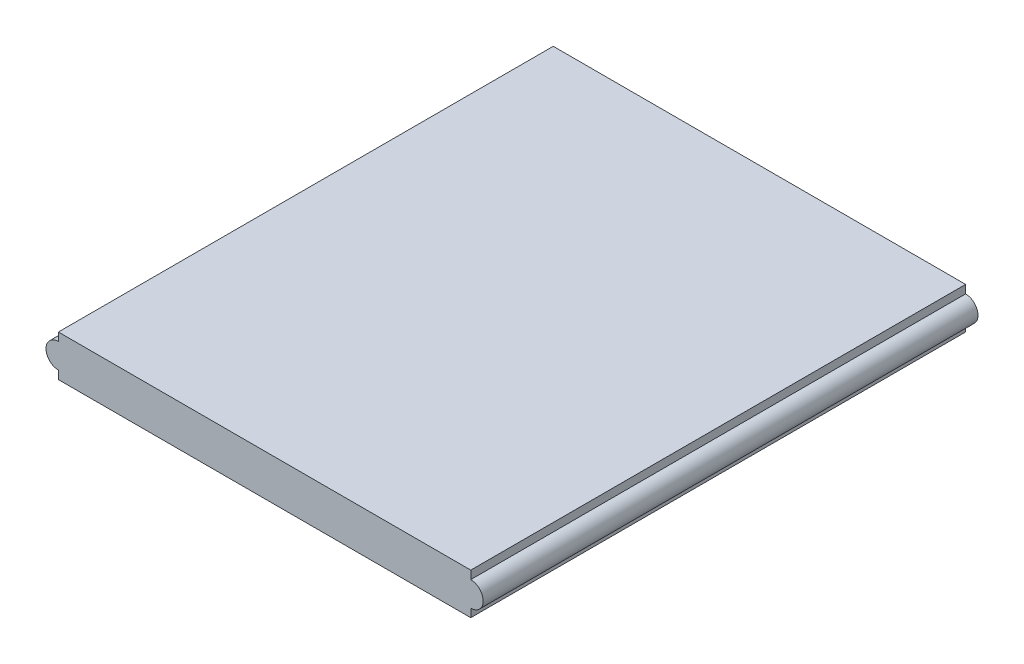
ISO-10303-21;
HEADER;
FILE_DESCRIPTION(('STEP AP214'),'2;1');
FILE_NAME('part.step','',(''),(''),'','','');
FILE_SCHEMA(('AUTOMOTIVE_DESIGN { 1 0 10303 214 1 1 1 1 }'));
ENDSEC;
DATA;
#1=APPLICATION_CONTEXT('core data for automotive mechanical design processes');
#2=APPLICATION_PROTOCOL_DEFINITION('international standard','automotive_design',2000,#1);
#3=PRODUCT_CONTEXT('',#1,'mechanical');
#4=PRODUCT('Part','Part','',(#3));
#5=PRODUCT_RELATED_PRODUCT_CATEGORY('part','',(#4));
#6=PRODUCT_DEFINITION_FORMATION('','',#4);
#7=PRODUCT_DEFINITION_CONTEXT('part definition',#1,'design');
#8=PRODUCT_DEFINITION('design','',#6,#7);
#9=PRODUCT_DEFINITION_SHAPE('','',#8);
#10=(LENGTH_UNIT() NAMED_UNIT(*) SI_UNIT(.MILLI.,.METRE.));
#11=(NAMED_UNIT(*) PLANE_ANGLE_UNIT() SI_UNIT($,.RADIAN.));
#12=(NAMED_UNIT(*) SI_UNIT($,.STERADIAN.) SOLID_ANGLE_UNIT());
#13=UNCERTAINTY_MEASURE_WITH_UNIT(LENGTH_MEASURE(1.E-05),#10,'distance_accuracy_value','');
#14=(GEOMETRIC_REPRESENTATION_CONTEXT(3) GLOBAL_UNCERTAINTY_ASSIGNED_CONTEXT((#13)) GLOBAL_UNIT_ASSIGNED_CONTEXT((#10,
#11,#12)) REPRESENTATION_CONTEXT('',''));
#15=CARTESIAN_POINT('',(0.,0.,0.));
#16=DIRECTION('',(0.,0.,1.));
#17=DIRECTION('',(1.,0.,0.));
#18=AXIS2_PLACEMENT_3D('',#15,#16,#17);
#19=CARTESIAN_POINT('',(-71.5081081081083,40.8229729729731,60.));
#20=DIRECTION('',(1.,0.,0.));
#21=DIRECTION('',(0.,0.,-1.));
#22=AXIS2_PLACEMENT_3D('',#19,#20,#21);
#23=PLANE('',#22);
#24=DIRECTION('',(0.,-1.,0.));
#25=VECTOR('',#24,1.);
#26=CARTESIAN_POINT('',(-71.5081081081083,40.8229729729731,0.));
#27=LINE('',#26,#25);
#28=CARTESIAN_POINT('',(-71.5081081081083,41.8229729729731,0.));
#29=VERTEX_POINT('',#28);
#30=CARTESIAN_POINT('',(-71.5081081081083,40.8229729729731,0.));
#31=VERTEX_POINT('',#30);
#32=EDGE_CURVE('E158',#29,#31,#27,.T.);
#33=ORIENTED_EDGE('',*,*,#32,.T.);
#34=DIRECTION('',(0.,0.,-1.));
#35=VECTOR('',#34,1.);
#36=CARTESIAN_POINT('',(-71.5081081081083,40.8229729729731,60.));
#37=LINE('',#36,#35);
#38=CARTESIAN_POINT('',(-71.5081081081083,40.8229729729731,60.));
#39=VERTEX_POINT('',#38);
#40=EDGE_CURVE('E11',#39,#31,#37,.T.);
#41=ORIENTED_EDGE('',*,*,#40,.F.);
#42=DIRECTION('',(0.,-1.,0.));
#43=VECTOR('',#42,1.);
#44=CARTESIAN_POINT('',(-71.5081081081083,40.8229729729731,60.));
#45=LINE('',#44,#43);
#46=CARTESIAN_POINT('',(-71.5081081081083,41.8229729729731,60.));
#47=VERTEX_POINT('',#46);
#48=EDGE_CURVE('E184',#47,#39,#45,.T.);
#49=ORIENTED_EDGE('',*,*,#48,.F.);
#50=DIRECTION('',(0.,0.,-1.));
#51=VECTOR('',#50,1.);
#52=CARTESIAN_POINT('',(-71.5081081081083,41.8229729729731,60.));
#53=LINE('',#52,#51);
#54=EDGE_CURVE('E152',#47,#29,#53,.T.);
#55=ORIENTED_EDGE('',*,*,#54,.T.);
#56=EDGE_LOOP('',(#33,#41,#49,#55));
#57=FACE_BOUND('',#56,.T.);
#58=ADVANCED_FACE('F44',(#57),#23,.F.);
#59=CARTESIAN_POINT('',(-71.5081081081083,40.8229729729731,60.));
#60=DIRECTION('',(0.,1.,0.));
#61=DIRECTION('',(0.,0.,1.));
#62=AXIS2_PLACEMENT_3D('',#59,#60,#61);
#63=PLANE('',#62);
#64=DIRECTION('',(-1.,0.,0.));
#65=VECTOR('',#64,1.);
#66=CARTESIAN_POINT('',(0.,40.8229729729731,10.));
#67=LINE('',#66,#65);
#68=CARTESIAN_POINT('',(-36.5081081081083,40.8229729729731,10.));
#69=VERTEX_POINT('',#68);
#70=CARTESIAN_POINT('',(-56.5081081081083,40.8229729729731,10.));
#71=VERTEX_POINT('',#70);
#72=EDGE_CURVE('E284',#69,#71,#67,.T.);
#73=ORIENTED_EDGE('',*,*,#72,.F.);
#74=DIRECTION('',(0.,0.,-1.));
#75=VECTOR('',#74,1.);
#76=CARTESIAN_POINT('',(-36.5081081081083,40.8229729729731,10.));
#77=LINE('',#76,#75);
#78=CARTESIAN_POINT('',(-36.5081081081083,40.8229729729731,0.));
#79=VERTEX_POINT('',#78);
#80=EDGE_CURVE('E234',#69,#79,#77,.T.);
#81=ORIENTED_EDGE('',*,*,#80,.T.);
#82=DIRECTION('',(1.,0.,0.));
#83=VECTOR('',#82,1.);
#84=CARTESIAN_POINT('',(-71.5081081081083,40.8229729729731,0.));
#85=LINE('',#84,#83);
#86=CARTESIAN_POINT('',(-21.5081081081083,40.8229729729731,0.));
#87=VERTEX_POINT('',#86);
#88=EDGE_CURVE('E165',#79,#87,#85,.T.);
#89=ORIENTED_EDGE('',*,*,#88,.T.);
#90=DIRECTION('',(0.,0.,-1.));
#91=VECTOR('',#90,1.);
#92=CARTESIAN_POINT('',(-21.5081081081083,40.8229729729731,60.));
#93=LINE('',#92,#91);
#94=CARTESIAN_POINT('',(-21.5081081081083,40.8229729729731,60.));
#95=VERTEX_POINT('',#94);
#96=EDGE_CURVE('E52',#95,#87,#93,.T.);
#97=ORIENTED_EDGE('',*,*,#96,.F.);
#98=DIRECTION('',(1.,0.,0.));
#99=VECTOR('',#98,1.);
#100=CARTESIAN_POINT('',(-71.5081081081083,40.8229729729731,60.));
#101=LINE('',#100,#99);
#102=EDGE_CURVE('E109',#39,#95,#101,.T.);
#103=ORIENTED_EDGE('',*,*,#102,.F.);
#104=ORIENTED_EDGE('',*,*,#40,.T.);
#105=CARTESIAN_POINT('',(-56.5081081081083,40.8229729729731,0.));
#106=VERTEX_POINT('',#105);
#107=EDGE_CURVE('E163',#31,#106,#85,.T.);
#108=ORIENTED_EDGE('',*,*,#107,.T.);
#109=DIRECTION('',(0.,0.,-1.));
#110=VECTOR('',#109,1.);
#111=CARTESIAN_POINT('',(-56.5081081081083,40.8229729729731,10.));
#112=LINE('',#111,#110);
#113=EDGE_CURVE('E239',#71,#106,#112,.T.);
#114=ORIENTED_EDGE('',*,*,#113,.F.);
#115=EDGE_LOOP('',(#73,#81,#89,#97,#103,#104,#108,#114));
#116=FACE_BOUND('',#115,.T.);
#117=ADVANCED_FACE('F329',(#116),#63,.F.);
#118=CARTESIAN_POINT('',(-21.5081081081083,40.8229729729731,60.));
#119=DIRECTION('',(-1.,0.,0.));
#120=DIRECTION('',(0.,0.,1.));
#121=AXIS2_PLACEMENT_3D('',#118,#119,#120);
#122=PLANE('',#121);
#123=DIRECTION('',(0.,1.,0.));
#124=VECTOR('',#123,1.);
#125=CARTESIAN_POINT('',(-21.5081081081083,40.8229729729731,0.));
#126=LINE('',#125,#124);
#127=CARTESIAN_POINT('',(-21.5081081081083,41.8229729729731,0.));
#128=VERTEX_POINT('',#127);
#129=EDGE_CURVE('E169',#87,#128,#126,.T.);
#130=ORIENTED_EDGE('',*,*,#129,.T.);
#131=DIRECTION('',(0.,0.,-1.));
#132=VECTOR('',#131,1.);
#133=CARTESIAN_POINT('',(-21.5081081081083,41.8229729729731,60.));
#134=LINE('',#133,#132);
#135=CARTESIAN_POINT('',(-21.5081081081083,41.8229729729731,60.));
#136=VERTEX_POINT('',#135);
#137=EDGE_CURVE('E191',#136,#128,#134,.T.);
#138=ORIENTED_EDGE('',*,*,#137,.F.);
#139=DIRECTION('',(0.,1.,0.));
#140=VECTOR('',#139,1.);
#141=CARTESIAN_POINT('',(-21.5081081081083,40.8229729729731,60.));
#142=LINE('',#141,#140);
#143=EDGE_CURVE('E202',#95,#136,#142,.T.);
#144=ORIENTED_EDGE('',*,*,#143,.F.);
#145=ORIENTED_EDGE('',*,*,#96,.T.);
#146=EDGE_LOOP('',(#130,#138,#144,#145));
#147=FACE_BOUND('',#146,.T.);
#148=ADVANCED_FACE('F201',(#147),#122,.F.);
#149=CARTESIAN_POINT('',(-21.5081081081083,43.3229729729731,60.));
#150=DIRECTION('',(0.,0.,-1.));
#151=DIRECTION('',(-1.,0.,0.));
#152=AXIS2_PLACEMENT_3D('',#149,#150,#151);
#153=CYLINDRICAL_SURFACE('',#152,1.49999999999999);
#154=CARTESIAN_POINT('',(-21.5081081081083,43.3229729729731,0.));
#155=DIRECTION('',(0.,0.,1.));
#156=DIRECTION('',(1.,0.,0.));
#157=AXIS2_PLACEMENT_3D('',#154,#155,#156);
#158=CIRCLE('',#157,1.49999999999999);
#159=CARTESIAN_POINT('',(-21.5081081081083,44.8229729729731,0.));
#160=VERTEX_POINT('',#159);
#161=EDGE_CURVE('E174',#128,#160,#158,.T.);
#162=ORIENTED_EDGE('',*,*,#161,.T.);
#163=DIRECTION('',(0.,0.,-1.));
#164=VECTOR('',#163,1.);
#165=CARTESIAN_POINT('',(-21.5081081081083,44.8229729729731,60.));
#166=LINE('',#165,#164);
#167=CARTESIAN_POINT('',(-21.5081081081083,44.8229729729731,60.));
#168=VERTEX_POINT('',#167);
#169=EDGE_CURVE('E192',#168,#160,#166,.T.);
#170=ORIENTED_EDGE('',*,*,#169,.F.);
#171=CARTESIAN_POINT('',(-21.5081081081083,43.3229729729731,60.));
#172=DIRECTION('',(0.,0.,1.));
#173=DIRECTION('',(1.,0.,0.));
#174=AXIS2_PLACEMENT_3D('',#171,#172,#173);
#175=CIRCLE('',#174,1.49999999999999);
#176=EDGE_CURVE('E219',#136,#168,#175,.T.);
#177=ORIENTED_EDGE('',*,*,#176,.F.);
#178=ORIENTED_EDGE('',*,*,#137,.T.);
#179=EDGE_LOOP('',(#162,#170,#177,#178));
#180=FACE_BOUND('',#179,.T.);
#181=ADVANCED_FACE('F214',(#180),#153,.T.);
#182=CARTESIAN_POINT('',(-21.5081081081083,44.8229729729731,60.));
#183=DIRECTION('',(-1.,0.,0.));
#184=DIRECTION('',(0.,0.,1.));
#185=AXIS2_PLACEMENT_3D('',#182,#183,#184);
#186=PLANE('',#185);
#187=DIRECTION('',(0.,1.,0.));
#188=VECTOR('',#187,1.);
#189=CARTESIAN_POINT('',(-21.5081081081083,44.8229729729731,0.));
#190=LINE('',#189,#188);
#191=CARTESIAN_POINT('',(-21.5081081081083,45.8229729729731,0.));
#192=VERTEX_POINT('',#191);
#193=EDGE_CURVE('E173',#160,#192,#190,.T.);
#194=ORIENTED_EDGE('',*,*,#193,.T.);
#195=DIRECTION('',(0.,0.,-1.));
#196=VECTOR('',#195,1.);
#197=CARTESIAN_POINT('',(-21.5081081081083,45.8229729729731,60.));
#198=LINE('',#197,#196);
#199=CARTESIAN_POINT('',(-21.5081081081083,45.8229729729731,60.));
#200=VERTEX_POINT('',#199);
#201=EDGE_CURVE('E150',#200,#192,#198,.T.);
#202=ORIENTED_EDGE('',*,*,#201,.F.);
#203=DIRECTION('',(0.,1.,0.));
#204=VECTOR('',#203,1.);
#205=CARTESIAN_POINT('',(-21.5081081081083,44.8229729729731,60.));
#206=LINE('',#205,#204);
#207=EDGE_CURVE('E135',#168,#200,#206,.T.);
#208=ORIENTED_EDGE('',*,*,#207,.F.);
#209=ORIENTED_EDGE('',*,*,#169,.T.);
#210=EDGE_LOOP('',(#194,#202,#208,#209));
#211=FACE_BOUND('',#210,.T.);
#212=ADVANCED_FACE('F217',(#211),#186,.F.);
#213=CARTESIAN_POINT('',(-71.5081081081083,45.8229729729731,60.));
#214=DIRECTION('',(0.,-1.,0.));
#215=DIRECTION('',(0.,0.,-1.));
#216=AXIS2_PLACEMENT_3D('',#213,#214,#215);
#217=PLANE('',#216);
#218=DIRECTION('',(-1.,0.,0.));
#219=VECTOR('',#218,1.);
#220=CARTESIAN_POINT('',(-71.5081081081083,45.8229729729731,0.));
#221=LINE('',#220,#219);
#222=CARTESIAN_POINT('',(-71.5081081081083,45.8229729729731,0.));
#223=VERTEX_POINT('',#222);
#224=EDGE_CURVE('E141',#192,#223,#221,.T.);
#225=ORIENTED_EDGE('',*,*,#224,.T.);
#226=DIRECTION('',(0.,0.,-1.));
#227=VECTOR('',#226,1.);
#228=CARTESIAN_POINT('',(-71.5081081081083,45.8229729729731,60.));
#229=LINE('',#228,#227);
#230=CARTESIAN_POINT('',(-71.5081081081083,45.8229729729731,60.));
#231=VERTEX_POINT('',#230);
#232=EDGE_CURVE('E136',#231,#223,#229,.T.);
#233=ORIENTED_EDGE('',*,*,#232,.F.);
#234=DIRECTION('',(-1.,0.,0.));
#235=VECTOR('',#234,1.);
#236=CARTESIAN_POINT('',(-71.5081081081083,45.8229729729731,60.));
#237=LINE('',#236,#235);
#238=EDGE_CURVE('E127',#200,#231,#237,.T.);
#239=ORIENTED_EDGE('',*,*,#238,.F.);
#240=ORIENTED_EDGE('',*,*,#201,.T.);
#241=EDGE_LOOP('',(#225,#233,#239,#240));
#242=FACE_BOUND('',#241,.T.);
#243=ADVANCED_FACE('F143',(#242),#217,.F.);
#244=CARTESIAN_POINT('',(-71.5081081081083,44.8229729729731,60.));
#245=DIRECTION('',(1.,0.,0.));
#246=DIRECTION('',(0.,0.,-1.));
#247=AXIS2_PLACEMENT_3D('',#244,#245,#246);
#248=PLANE('',#247);
#249=DIRECTION('',(0.,-1.,0.));
#250=VECTOR('',#249,1.);
#251=CARTESIAN_POINT('',(-71.5081081081083,44.8229729729731,0.));
#252=LINE('',#251,#250);
#253=CARTESIAN_POINT('',(-71.5081081081083,44.8229729729731,0.));
#254=VERTEX_POINT('',#253);
#255=EDGE_CURVE('E179',#223,#254,#252,.T.);
#256=ORIENTED_EDGE('',*,*,#255,.T.);
#257=DIRECTION('',(0.,0.,-1.));
#258=VECTOR('',#257,1.);
#259=CARTESIAN_POINT('',(-71.5081081081083,44.8229729729731,60.));
#260=LINE('',#259,#258);
#261=CARTESIAN_POINT('',(-71.5081081081083,44.8229729729731,60.));
#262=VERTEX_POINT('',#261);
#263=EDGE_CURVE('E146',#262,#254,#260,.T.);
#264=ORIENTED_EDGE('',*,*,#263,.F.);
#265=DIRECTION('',(0.,-1.,0.));
#266=VECTOR('',#265,1.);
#267=CARTESIAN_POINT('',(-71.5081081081083,44.8229729729731,60.));
#268=LINE('',#267,#266);
#269=EDGE_CURVE('E128',#231,#262,#268,.T.);
#270=ORIENTED_EDGE('',*,*,#269,.F.);
#271=ORIENTED_EDGE('',*,*,#232,.T.);
#272=EDGE_LOOP('',(#256,#264,#270,#271));
#273=FACE_BOUND('',#272,.T.);
#274=ADVANCED_FACE('F147',(#273),#248,.F.);
#275=CARTESIAN_POINT('',(-71.5081081081083,43.3229729729731,60.));
#276=DIRECTION('',(0.,0.,-1.));
#277=DIRECTION('',(-1.,0.,0.));
#278=AXIS2_PLACEMENT_3D('',#275,#276,#277);
#279=CYLINDRICAL_SURFACE('',#278,1.5);
#280=CARTESIAN_POINT('',(-71.5081081081083,43.3229729729731,0.));
#281=DIRECTION('',(0.,0.,1.));
#282=DIRECTION('',(1.,0.,0.));
#283=AXIS2_PLACEMENT_3D('',#280,#281,#282);
#284=CIRCLE('',#283,1.5);
#285=EDGE_CURVE('E105',#254,#29,#284,.T.);
#286=ORIENTED_EDGE('',*,*,#285,.T.);
#287=ORIENTED_EDGE('',*,*,#54,.F.);
#288=CARTESIAN_POINT('',(-71.5081081081083,43.3229729729731,60.));
#289=DIRECTION('',(0.,0.,1.));
#290=DIRECTION('',(1.,0.,0.));
#291=AXIS2_PLACEMENT_3D('',#288,#289,#290);
#292=CIRCLE('',#291,1.5);
#293=EDGE_CURVE('E69',#262,#47,#292,.T.);
#294=ORIENTED_EDGE('',*,*,#293,.F.);
#295=ORIENTED_EDGE('',*,*,#263,.T.);
#296=EDGE_LOOP('',(#286,#287,#294,#295));
#297=FACE_BOUND('',#296,.T.);
#298=ADVANCED_FACE('F339',(#297),#279,.T.);
#299=CARTESIAN_POINT('',(-71.5081081081083,43.3229729729731,60.));
#300=DIRECTION('',(0.,0.,1.));
#301=DIRECTION('',(1.,0.,0.));
#302=AXIS2_PLACEMENT_3D('',#299,#300,#301);
#303=PLANE('',#302);
#304=ORIENTED_EDGE('',*,*,#48,.T.);
#305=ORIENTED_EDGE('',*,*,#102,.T.);
#306=ORIENTED_EDGE('',*,*,#143,.T.);
#307=ORIENTED_EDGE('',*,*,#176,.T.);
#308=ORIENTED_EDGE('',*,*,#207,.T.);
#309=ORIENTED_EDGE('',*,*,#238,.T.);
#310=ORIENTED_EDGE('',*,*,#269,.T.);
#311=ORIENTED_EDGE('',*,*,#293,.T.);
#312=EDGE_LOOP('',(#304,#305,#306,#307,#308,#309,#310,#311));
#313=FACE_BOUND('',#312,.T.);
#314=ADVANCED_FACE('F126',(#313),#303,.T.);
#315=CARTESIAN_POINT('',(-71.5081081081083,43.3229729729731,0.));
#316=DIRECTION('',(0.,0.,1.));
#317=DIRECTION('',(1.,0.,0.));
#318=AXIS2_PLACEMENT_3D('',#315,#316,#317);
#319=PLANE('',#318);
#320=DIRECTION('',(0.,1.,0.));
#321=VECTOR('',#320,1.);
#322=CARTESIAN_POINT('',(-56.5081081081077,-7.84207533745358E-13,0.));
#323=LINE('',#322,#321);
#324=CARTESIAN_POINT('',(-56.5081081081083,41.3229729729731,0.));
#325=VERTEX_POINT('',#324);
#326=EDGE_CURVE('E58',#106,#325,#323,.T.);
#327=ORIENTED_EDGE('',*,*,#326,.F.);
#328=ORIENTED_EDGE('',*,*,#107,.F.);
#329=ORIENTED_EDGE('',*,*,#32,.F.);
#330=ORIENTED_EDGE('',*,*,#285,.F.);
#331=ORIENTED_EDGE('',*,*,#255,.F.);
#332=ORIENTED_EDGE('',*,*,#224,.F.);
#333=ORIENTED_EDGE('',*,*,#193,.F.);
#334=ORIENTED_EDGE('',*,*,#161,.F.);
#335=ORIENTED_EDGE('',*,*,#129,.F.);
#336=ORIENTED_EDGE('',*,*,#88,.F.);
#337=DIRECTION('',(0.,1.,0.));
#338=VECTOR('',#337,1.);
#339=CARTESIAN_POINT('',(-36.5081081081088,5.06651777589084E-13,0.));
#340=LINE('',#339,#338);
#341=CARTESIAN_POINT('',(-36.5081081081083,41.3229729729731,0.));
#342=VERTEX_POINT('',#341);
#343=EDGE_CURVE('E263',#79,#342,#340,.T.);
#344=ORIENTED_EDGE('',*,*,#343,.T.);
#345=CARTESIAN_POINT('',(-38.5081081081083,41.3229729729731,0.));
#346=DIRECTION('',(0.,0.,-1.));
#347=DIRECTION('',(-1.,0.,0.));
#348=AXIS2_PLACEMENT_3D('',#345,#346,#347);
#349=CIRCLE('',#348,2.00000000000001);
#350=CARTESIAN_POINT('',(-38.5081081081083,43.3229729729731,0.));
#351=VERTEX_POINT('',#350);
#352=EDGE_CURVE('E266',#342,#351,#349,.F.);
#353=ORIENTED_EDGE('',*,*,#352,.T.);
#354=DIRECTION('',(-1.,0.,0.));
#355=VECTOR('',#354,1.);
#356=CARTESIAN_POINT('',(0.,43.3229729729731,0.));
#357=LINE('',#356,#355);
#358=CARTESIAN_POINT('',(-54.5081081081083,43.3229729729731,0.));
#359=VERTEX_POINT('',#358);
#360=EDGE_CURVE('E252',#351,#359,#357,.T.);
#361=ORIENTED_EDGE('',*,*,#360,.T.);
#362=CARTESIAN_POINT('',(-54.5081081081083,41.3229729729731,0.));
#363=DIRECTION('',(0.,0.,-1.));
#364=DIRECTION('',(-1.,0.,0.));
#365=AXIS2_PLACEMENT_3D('',#362,#363,#364);
#366=CIRCLE('',#365,2.00000000000001);
#367=EDGE_CURVE('E260',#359,#325,#366,.F.);
#368=ORIENTED_EDGE('',*,*,#367,.T.);
#369=EDGE_LOOP('',(#327,#328,#329,#330,#331,#332,#333,#334,#335,#336,#344,#353,#361,#368));
#370=FACE_BOUND('',#369,.T.);
#371=ADVANCED_FACE('F207',(#370),#319,.F.);
#372=CARTESIAN_POINT('',(-38.5081081081083,41.3229729729731,10.));
#373=DIRECTION('',(0.,0.,-1.));
#374=DIRECTION('',(-1.,0.,0.));
#375=AXIS2_PLACEMENT_3D('',#372,#373,#374);
#376=CYLINDRICAL_SURFACE('',#375,2.00000000000001);
#377=ORIENTED_EDGE('',*,*,#352,.F.);
#378=DIRECTION('',(0.,0.,-1.));
#379=VECTOR('',#378,1.);
#380=CARTESIAN_POINT('',(-36.5081081081083,41.3229729729731,10.));
#381=LINE('',#380,#379);
#382=CARTESIAN_POINT('',(-36.5081081081083,41.3229729729731,10.));
#383=VERTEX_POINT('',#382);
#384=EDGE_CURVE('E227',#383,#342,#381,.T.);
#385=ORIENTED_EDGE('',*,*,#384,.F.);
#386=CARTESIAN_POINT('',(-38.5081081081083,41.3229729729731,10.));
#387=DIRECTION('',(0.,0.,-1.));
#388=DIRECTION('',(-1.,0.,0.));
#389=AXIS2_PLACEMENT_3D('',#386,#387,#388);
#390=CIRCLE('',#389,2.00000000000001);
#391=CARTESIAN_POINT('',(-38.5081081081083,43.3229729729731,10.));
#392=VERTEX_POINT('',#391);
#393=EDGE_CURVE('E258',#383,#392,#390,.F.);
#394=ORIENTED_EDGE('',*,*,#393,.T.);
#395=DIRECTION('',(0.,0.,-1.));
#396=VECTOR('',#395,1.);
#397=CARTESIAN_POINT('',(-38.5081081081083,43.3229729729731,10.));
#398=LINE('',#397,#396);
#399=EDGE_CURVE('E162',#392,#351,#398,.T.);
#400=ORIENTED_EDGE('',*,*,#399,.T.);
#401=EDGE_LOOP('',(#377,#385,#394,#400));
#402=FACE_BOUND('',#401,.T.);
#403=ADVANCED_FACE('F299',(#402),#376,.F.);
#404=CARTESIAN_POINT('',(0.,43.3229729729731,10.));
#405=DIRECTION('',(0.,-1.,0.));
#406=DIRECTION('',(0.,0.,-1.));
#407=AXIS2_PLACEMENT_3D('',#404,#405,#406);
#408=PLANE('',#407);
#409=ORIENTED_EDGE('',*,*,#360,.F.);
#410=ORIENTED_EDGE('',*,*,#399,.F.);
#411=DIRECTION('',(-1.,0.,0.));
#412=VECTOR('',#411,1.);
#413=CARTESIAN_POINT('',(0.,43.3229729729731,10.));
#414=LINE('',#413,#412);
#415=CARTESIAN_POINT('',(-54.5081081081083,43.3229729729731,10.));
#416=VERTEX_POINT('',#415);
#417=EDGE_CURVE('E231',#392,#416,#414,.T.);
#418=ORIENTED_EDGE('',*,*,#417,.T.);
#419=DIRECTION('',(0.,0.,-1.));
#420=VECTOR('',#419,1.);
#421=CARTESIAN_POINT('',(-54.5081081081083,43.3229729729731,10.));
#422=LINE('',#421,#420);
#423=EDGE_CURVE('E242',#416,#359,#422,.T.);
#424=ORIENTED_EDGE('',*,*,#423,.T.);
#425=EDGE_LOOP('',(#409,#410,#418,#424));
#426=FACE_BOUND('',#425,.T.);
#427=ADVANCED_FACE('F301',(#426),#408,.T.);
#428=CARTESIAN_POINT('',(-54.5081081081083,41.3229729729731,10.));
#429=DIRECTION('',(0.,0.,-1.));
#430=DIRECTION('',(-1.,0.,0.));
#431=AXIS2_PLACEMENT_3D('',#428,#429,#430);
#432=CYLINDRICAL_SURFACE('',#431,2.00000000000001);
#433=ORIENTED_EDGE('',*,*,#367,.F.);
#434=ORIENTED_EDGE('',*,*,#423,.F.);
#435=CARTESIAN_POINT('',(-54.5081081081083,41.3229729729731,10.));
#436=DIRECTION('',(0.,0.,-1.));
#437=DIRECTION('',(-1.,0.,0.));
#438=AXIS2_PLACEMENT_3D('',#435,#436,#437);
#439=CIRCLE('',#438,2.00000000000001);
#440=CARTESIAN_POINT('',(-56.5081081081083,41.3229729729731,10.));
#441=VERTEX_POINT('',#440);
#442=EDGE_CURVE('E272',#416,#441,#439,.F.);
#443=ORIENTED_EDGE('',*,*,#442,.T.);
#444=DIRECTION('',(0.,0.,-1.));
#445=VECTOR('',#444,1.);
#446=CARTESIAN_POINT('',(-56.5081081081083,41.3229729729731,10.));
#447=LINE('',#446,#445);
#448=EDGE_CURVE('E241',#441,#325,#447,.T.);
#449=ORIENTED_EDGE('',*,*,#448,.T.);
#450=EDGE_LOOP('',(#433,#434,#443,#449));
#451=FACE_BOUND('',#450,.T.);
#452=ADVANCED_FACE('F404',(#451),#432,.F.);
#453=CARTESIAN_POINT('',(-56.5081081081077,-7.84207533745358E-13,10.));
#454=DIRECTION('',(-1.,0.,0.));
#455=DIRECTION('',(0.,-1.,0.));
#456=AXIS2_PLACEMENT_3D('',#453,#454,#455);
#457=PLANE('',#456);
#458=ORIENTED_EDGE('',*,*,#326,.T.);
#459=ORIENTED_EDGE('',*,*,#448,.F.);
#460=DIRECTION('',(0.,1.,0.));
#461=VECTOR('',#460,1.);
#462=CARTESIAN_POINT('',(-56.5081081081077,-7.84207533745358E-13,10.));
#463=LINE('',#462,#461);
#464=EDGE_CURVE('E280',#71,#441,#463,.T.);
#465=ORIENTED_EDGE('',*,*,#464,.F.);
#466=ORIENTED_EDGE('',*,*,#113,.T.);
#467=EDGE_LOOP('',(#458,#459,#465,#466));
#468=FACE_BOUND('',#467,.T.);
#469=ADVANCED_FACE('F332',(#468),#457,.F.);
#470=CARTESIAN_POINT('',(-36.5081081081088,5.06651777589084E-13,10.));
#471=DIRECTION('',(-1.,0.,0.));
#472=DIRECTION('',(0.,-1.,0.));
#473=AXIS2_PLACEMENT_3D('',#470,#471,#472);
#474=PLANE('',#473);
#475=ORIENTED_EDGE('',*,*,#343,.F.);
#476=ORIENTED_EDGE('',*,*,#80,.F.);
#477=DIRECTION('',(0.,1.,0.));
#478=VECTOR('',#477,1.);
#479=CARTESIAN_POINT('',(-36.5081081081088,5.06651777589084E-13,10.));
#480=LINE('',#479,#478);
#481=EDGE_CURVE('E282',#69,#383,#480,.T.);
#482=ORIENTED_EDGE('',*,*,#481,.T.);
#483=ORIENTED_EDGE('',*,*,#384,.T.);
#484=EDGE_LOOP('',(#475,#476,#482,#483));
#485=FACE_BOUND('',#484,.T.);
#486=ADVANCED_FACE('F326',(#485),#474,.T.);
#487=CARTESIAN_POINT('',(0.,0.,10.));
#488=DIRECTION('',(0.,0.,-1.));
#489=DIRECTION('',(-1.,0.,0.));
#490=AXIS2_PLACEMENT_3D('',#487,#488,#489);
#491=PLANE('',#490);
#492=ORIENTED_EDGE('',*,*,#393,.F.);
#493=ORIENTED_EDGE('',*,*,#481,.F.);
#494=ORIENTED_EDGE('',*,*,#72,.T.);
#495=ORIENTED_EDGE('',*,*,#464,.T.);
#496=ORIENTED_EDGE('',*,*,#442,.F.);
#497=ORIENTED_EDGE('',*,*,#417,.F.);
#498=EDGE_LOOP('',(#492,#493,#494,#495,#496,#497));
#499=FACE_BOUND('',#498,.T.);
#500=ADVANCED_FACE('F327',(#499),#491,.T.);
#501=CLOSED_SHELL('',(#58,#117,#148,#181,#212,#243,#274,#298,#314,#371,#403,#427,#452,#469,#486,#500));
#502=MANIFOLD_SOLID_BREP('B2',#501);
#503=ADVANCED_BREP_SHAPE_REPRESENTATION('',(#18,#502),#14);
#504=SHAPE_DEFINITION_REPRESENTATION(#9,#503);
ENDSEC;
END-ISO-10303-21;
